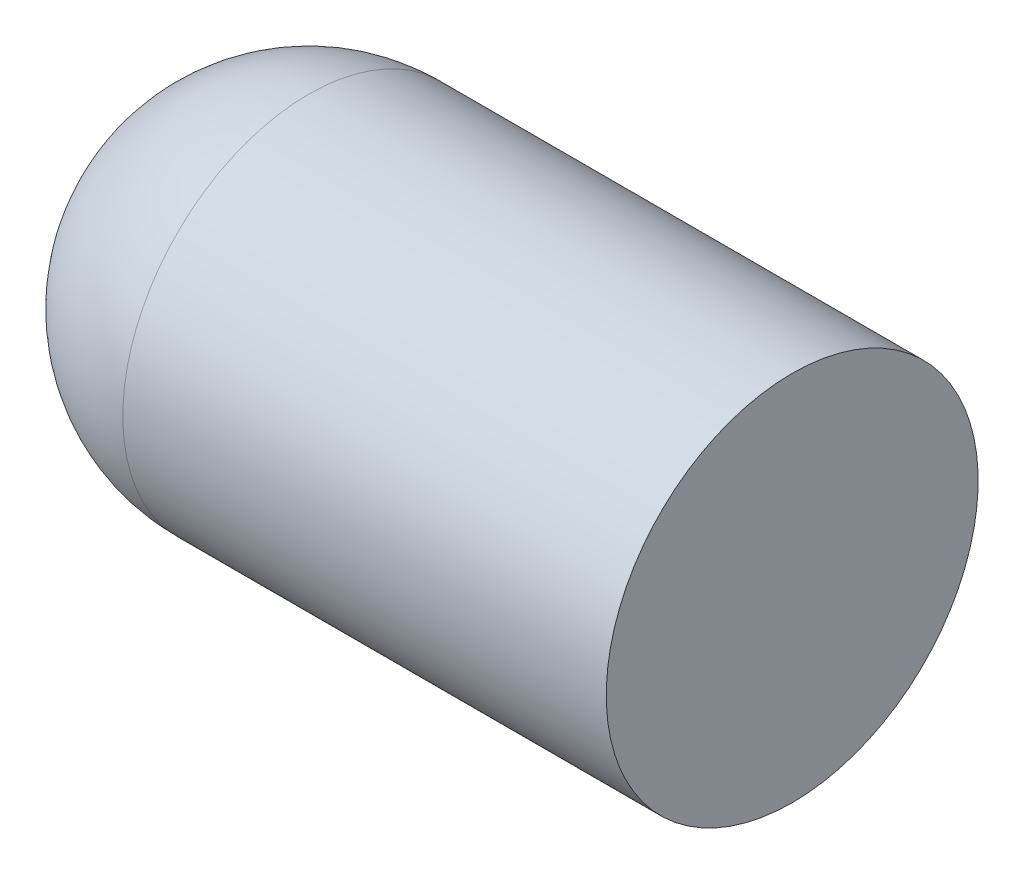
ISO-10303-21;
HEADER;
FILE_DESCRIPTION(('STEP AP214'),'2;1');
FILE_NAME('part.step','',(''),(''),'','','');
FILE_SCHEMA(('AUTOMOTIVE_DESIGN { 1 0 10303 214 1 1 1 1 }'));
ENDSEC;
DATA;
#1=APPLICATION_CONTEXT('core data for automotive mechanical design processes');
#2=APPLICATION_PROTOCOL_DEFINITION('international standard','automotive_design',2000,#1);
#3=PRODUCT_CONTEXT('',#1,'mechanical');
#4=PRODUCT('Part','Part','',(#3));
#5=PRODUCT_RELATED_PRODUCT_CATEGORY('part','',(#4));
#6=PRODUCT_DEFINITION_FORMATION('','',#4);
#7=PRODUCT_DEFINITION_CONTEXT('part definition',#1,'design');
#8=PRODUCT_DEFINITION('design','',#6,#7);
#9=PRODUCT_DEFINITION_SHAPE('','',#8);
#10=(LENGTH_UNIT() NAMED_UNIT(*) SI_UNIT(.MILLI.,.METRE.));
#11=(NAMED_UNIT(*) PLANE_ANGLE_UNIT() SI_UNIT($,.RADIAN.));
#12=(NAMED_UNIT(*) SI_UNIT($,.STERADIAN.) SOLID_ANGLE_UNIT());
#13=UNCERTAINTY_MEASURE_WITH_UNIT(LENGTH_MEASURE(1.E-05),#10,'distance_accuracy_value','');
#14=(GEOMETRIC_REPRESENTATION_CONTEXT(3) GLOBAL_UNCERTAINTY_ASSIGNED_CONTEXT((#13)) GLOBAL_UNIT_ASSIGNED_CONTEXT((#10,
#11,#12)) REPRESENTATION_CONTEXT('',''));
#15=CARTESIAN_POINT('',(0.,0.,0.));
#16=DIRECTION('',(0.,0.,1.));
#17=DIRECTION('',(1.,0.,0.));
#18=AXIS2_PLACEMENT_3D('',#15,#16,#17);
#19=CARTESIAN_POINT('',(0.,0.,0.));
#20=DIRECTION('',(1.,0.,0.));
#21=DIRECTION('',(0.,1.,0.));
#22=AXIS2_PLACEMENT_3D('',#19,#20,#21);
#23=SPHERICAL_SURFACE('',#22,5.);
#24=CARTESIAN_POINT('',(0.,0.,0.));
#25=DIRECTION('',(1.,0.,0.));
#26=DIRECTION('',(0.,1.,0.));
#27=AXIS2_PLACEMENT_3D('',#24,#25,#26);
#28=CIRCLE('',#27,5.);
#29=CARTESIAN_POINT('',(0.,5.,0.));
#30=VERTEX_POINT('',#29);
#31=EDGE_CURVE('E10',#30,#30,#28,.T.);
#32=ORIENTED_EDGE('',*,*,#31,.F.);
#33=EDGE_LOOP('',(#32));
#34=FACE_BOUND('',#33,.T.);
#35=ADVANCED_FACE('F31',(#34),#23,.T.);
#36=CARTESIAN_POINT('',(13.,0.,0.));
#37=DIRECTION('',(1.,0.,0.));
#38=DIRECTION('',(0.,1.,0.));
#39=AXIS2_PLACEMENT_3D('',#36,#37,#38);
#40=CYLINDRICAL_SURFACE('',#39,5.);
#41=ORIENTED_EDGE('',*,*,#31,.T.);
#42=EDGE_LOOP('',(#41));
#43=FACE_BOUND('',#42,.T.);
#44=CARTESIAN_POINT('',(13.,0.,0.));
#45=DIRECTION('',(1.,0.,0.));
#46=DIRECTION('',(0.,1.,0.));
#47=AXIS2_PLACEMENT_3D('',#44,#45,#46);
#48=CIRCLE('',#47,5.);
#49=CARTESIAN_POINT('',(13.,5.,0.));
#50=VERTEX_POINT('',#49);
#51=EDGE_CURVE('E37',#50,#50,#48,.T.);
#52=ORIENTED_EDGE('',*,*,#51,.F.);
#53=EDGE_LOOP('',(#52));
#54=FACE_BOUND('',#53,.T.);
#55=ADVANCED_FACE('F45',(#43,#54),#40,.T.);
#56=CARTESIAN_POINT('',(13.,5.,0.));
#57=DIRECTION('',(1.,0.,0.));
#58=DIRECTION('',(0.,1.,0.));
#59=AXIS2_PLACEMENT_3D('',#56,#57,#58);
#60=PLANE('',#59);
#61=ORIENTED_EDGE('',*,*,#51,.T.);
#62=EDGE_LOOP('',(#61));
#63=FACE_BOUND('',#62,.T.);
#64=ADVANCED_FACE('F43',(#63),#60,.T.);
#65=CLOSED_SHELL('',(#35,#55,#64));
#66=MANIFOLD_SOLID_BREP('B2',#65);
#67=ADVANCED_BREP_SHAPE_REPRESENTATION('',(#18,#66),#14);
#68=SHAPE_DEFINITION_REPRESENTATION(#9,#67);
ENDSEC;
END-ISO-10303-21;
